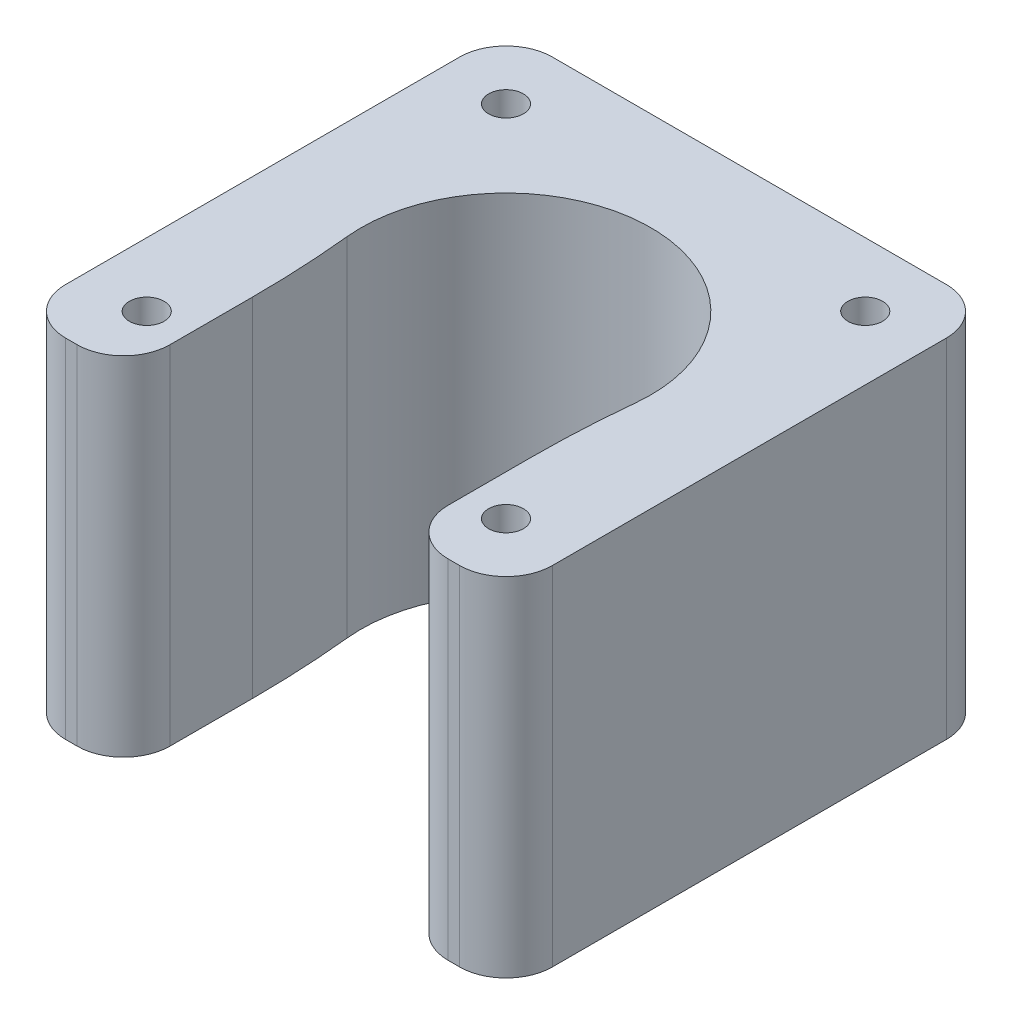
ISO-10303-21;
HEADER;
FILE_DESCRIPTION(('STEP AP214'),'2;1');
FILE_NAME('part.step','',(''),(''),'','','');
FILE_SCHEMA(('AUTOMOTIVE_DESIGN { 1 0 10303 214 1 1 1 1 }'));
ENDSEC;
DATA;
#1=APPLICATION_CONTEXT('core data for automotive mechanical design processes');
#2=APPLICATION_PROTOCOL_DEFINITION('international standard','automotive_design',2000,#1);
#3=PRODUCT_CONTEXT('',#1,'mechanical');
#4=PRODUCT('Part','Part','',(#3));
#5=PRODUCT_RELATED_PRODUCT_CATEGORY('part','',(#4));
#6=PRODUCT_DEFINITION_FORMATION('','',#4);
#7=PRODUCT_DEFINITION_CONTEXT('part definition',#1,'design');
#8=PRODUCT_DEFINITION('design','',#6,#7);
#9=PRODUCT_DEFINITION_SHAPE('','',#8);
#10=(LENGTH_UNIT() NAMED_UNIT(*) SI_UNIT(.MILLI.,.METRE.));
#11=(NAMED_UNIT(*) PLANE_ANGLE_UNIT() SI_UNIT($,.RADIAN.));
#12=(NAMED_UNIT(*) SI_UNIT($,.STERADIAN.) SOLID_ANGLE_UNIT());
#13=UNCERTAINTY_MEASURE_WITH_UNIT(LENGTH_MEASURE(1.E-05),#10,'distance_accuracy_value','');
#14=(GEOMETRIC_REPRESENTATION_CONTEXT(3) GLOBAL_UNCERTAINTY_ASSIGNED_CONTEXT((#13)) GLOBAL_UNIT_ASSIGNED_CONTEXT((#10,
#11,#12)) REPRESENTATION_CONTEXT('',''));
#15=CARTESIAN_POINT('',(0.,0.,0.));
#16=DIRECTION('',(0.,0.,1.));
#17=DIRECTION('',(1.,0.,0.));
#18=AXIS2_PLACEMENT_3D('',#15,#16,#17);
#19=CARTESIAN_POINT('',(0.,30.,0.));
#20=DIRECTION('',(0.,-1.,0.));
#21=DIRECTION('',(0.,0.,-1.));
#22=AXIS2_PLACEMENT_3D('',#19,#20,#21);
#23=CYLINDRICAL_SURFACE('',#22,12.5);
#24=CARTESIAN_POINT('',(0.,30.,0.));
#25=DIRECTION('',(0.,1.,0.));
#26=DIRECTION('',(0.,0.,1.));
#27=AXIS2_PLACEMENT_3D('',#24,#25,#26);
#28=CIRCLE('',#27,12.5);
#29=CARTESIAN_POINT('',(12.4358974358974,30.,1.26430018739205));
#30=VERTEX_POINT('',#29);
#31=CARTESIAN_POINT('',(-12.4358974358974,30.,1.26430018739205));
#32=VERTEX_POINT('',#31);
#33=EDGE_CURVE('E296',#30,#32,#28,.T.);
#34=ORIENTED_EDGE('',*,*,#33,.T.);
#35=DIRECTION('',(0.,-1.,0.));
#36=VECTOR('',#35,1.);
#37=CARTESIAN_POINT('',(-12.4358974358974,30.,1.26430018739205));
#38=LINE('',#37,#36);
#39=CARTESIAN_POINT('',(-12.4358974358974,0.,1.26430018739205));
#40=VERTEX_POINT('',#39);
#41=EDGE_CURVE('E162',#32,#40,#38,.T.);
#42=ORIENTED_EDGE('',*,*,#41,.T.);
#43=CARTESIAN_POINT('',(0.,0.,0.));
#44=DIRECTION('',(0.,1.,0.));
#45=DIRECTION('',(0.,0.,1.));
#46=AXIS2_PLACEMENT_3D('',#43,#44,#45);
#47=CIRCLE('',#46,12.5);
#48=CARTESIAN_POINT('',(12.4358974358974,0.,1.26430018739205));
#49=VERTEX_POINT('',#48);
#50=EDGE_CURVE('E154',#49,#40,#47,.T.);
#51=ORIENTED_EDGE('',*,*,#50,.F.);
#52=DIRECTION('',(0.,-1.,0.));
#53=VECTOR('',#52,1.);
#54=CARTESIAN_POINT('',(12.4358974358974,30.,1.26430018739205));
#55=LINE('',#54,#53);
#56=EDGE_CURVE('E167',#49,#30,#55,.F.);
#57=ORIENTED_EDGE('',*,*,#56,.T.);
#58=EDGE_LOOP('',(#34,#42,#51,#57));
#59=FACE_BOUND('',#58,.T.);
#60=ADVANCED_FACE('F36',(#59),#23,.F.);
#61=CARTESIAN_POINT('',(12.,30.,0.));
#62=DIRECTION('',(1.,0.,0.));
#63=DIRECTION('',(0.,0.,-1.));
#64=AXIS2_PLACEMENT_3D('',#61,#62,#63);
#65=PLANE('',#64);
#66=DIRECTION('',(0.,0.,1.));
#67=VECTOR('',#66,1.);
#68=CARTESIAN_POINT('',(12.,0.,0.));
#69=LINE('',#68,#67);
#70=CARTESIAN_POINT('',(12.,0.,9.86154146165802));
#71=VERTEX_POINT('',#70);
#72=CARTESIAN_POINT('',(12.,0.,17.));
#73=VERTEX_POINT('',#72);
#74=EDGE_CURVE('E156',#71,#73,#69,.T.);
#75=ORIENTED_EDGE('',*,*,#74,.T.);
#76=DIRECTION('',(0.,-1.,0.));
#77=VECTOR('',#76,1.);
#78=CARTESIAN_POINT('',(12.,30.,17.));
#79=LINE('',#78,#77);
#80=CARTESIAN_POINT('',(12.,30.,17.));
#81=VERTEX_POINT('',#80);
#82=EDGE_CURVE('E11',#73,#81,#79,.F.);
#83=ORIENTED_EDGE('',*,*,#82,.T.);
#84=DIRECTION('',(0.,0.,1.));
#85=VECTOR('',#84,1.);
#86=CARTESIAN_POINT('',(12.,30.,0.));
#87=LINE('',#86,#85);
#88=CARTESIAN_POINT('',(12.,30.,9.86154146165802));
#89=VERTEX_POINT('',#88);
#90=EDGE_CURVE('E259',#89,#81,#87,.T.);
#91=ORIENTED_EDGE('',*,*,#90,.F.);
#92=DIRECTION('',(0.,1.,0.));
#93=VECTOR('',#92,1.);
#94=CARTESIAN_POINT('',(12.,0.,9.86154146165802));
#95=LINE('',#94,#93);
#96=EDGE_CURVE('E191',#89,#71,#95,.F.);
#97=ORIENTED_EDGE('',*,*,#96,.T.);
#98=EDGE_LOOP('',(#75,#83,#91,#97));
#99=FACE_BOUND('',#98,.T.);
#100=ADVANCED_FACE('F318',(#99),#65,.F.);
#101=CARTESIAN_POINT('',(0.,30.,21.));
#102=DIRECTION('',(0.,0.,-1.));
#103=DIRECTION('',(-1.,0.,0.));
#104=AXIS2_PLACEMENT_3D('',#101,#102,#103);
#105=PLANE('',#104);
#106=DIRECTION('',(1.,0.,0.));
#107=VECTOR('',#106,1.);
#108=CARTESIAN_POINT('',(0.,0.,21.));
#109=LINE('',#108,#107);
#110=CARTESIAN_POINT('',(16.,0.,21.));
#111=VERTEX_POINT('',#110);
#112=CARTESIAN_POINT('',(17.,0.,21.));
#113=VERTEX_POINT('',#112);
#114=EDGE_CURVE('E249',#111,#113,#109,.T.);
#115=ORIENTED_EDGE('',*,*,#114,.T.);
#116=DIRECTION('',(0.,-1.,0.));
#117=VECTOR('',#116,1.);
#118=CARTESIAN_POINT('',(17.,30.,21.));
#119=LINE('',#118,#117);
#120=CARTESIAN_POINT('',(17.,30.,21.));
#121=VERTEX_POINT('',#120);
#122=EDGE_CURVE('E44',#113,#121,#119,.F.);
#123=ORIENTED_EDGE('',*,*,#122,.T.);
#124=DIRECTION('',(1.,0.,0.));
#125=VECTOR('',#124,1.);
#126=CARTESIAN_POINT('',(0.,30.,21.));
#127=LINE('',#126,#125);
#128=CARTESIAN_POINT('',(16.,30.,21.));
#129=VERTEX_POINT('',#128);
#130=EDGE_CURVE('E246',#129,#121,#127,.T.);
#131=ORIENTED_EDGE('',*,*,#130,.F.);
#132=DIRECTION('',(0.,-1.,0.));
#133=VECTOR('',#132,1.);
#134=CARTESIAN_POINT('',(16.,30.,21.));
#135=LINE('',#134,#133);
#136=EDGE_CURVE('E238',#129,#111,#135,.T.);
#137=ORIENTED_EDGE('',*,*,#136,.T.);
#138=EDGE_LOOP('',(#115,#123,#131,#137));
#139=FACE_BOUND('',#138,.T.);
#140=ADVANCED_FACE('F245',(#139),#105,.F.);
#141=CARTESIAN_POINT('',(21.,30.,0.));
#142=DIRECTION('',(-1.,0.,0.));
#143=DIRECTION('',(0.,0.,1.));
#144=AXIS2_PLACEMENT_3D('',#141,#142,#143);
#145=PLANE('',#144);
#146=DIRECTION('',(0.,0.,-1.));
#147=VECTOR('',#146,1.);
#148=CARTESIAN_POINT('',(21.,0.,0.));
#149=LINE('',#148,#147);
#150=CARTESIAN_POINT('',(21.,0.,17.));
#151=VERTEX_POINT('',#150);
#152=CARTESIAN_POINT('',(21.,0.,-17.));
#153=VERTEX_POINT('',#152);
#154=EDGE_CURVE('E267',#151,#153,#149,.T.);
#155=ORIENTED_EDGE('',*,*,#154,.T.);
#156=DIRECTION('',(0.,-1.,0.));
#157=VECTOR('',#156,1.);
#158=CARTESIAN_POINT('',(21.,30.,-17.));
#159=LINE('',#158,#157);
#160=CARTESIAN_POINT('',(21.,30.,-17.));
#161=VERTEX_POINT('',#160);
#162=EDGE_CURVE('E229',#153,#161,#159,.F.);
#163=ORIENTED_EDGE('',*,*,#162,.T.);
#164=DIRECTION('',(0.,0.,-1.));
#165=VECTOR('',#164,1.);
#166=CARTESIAN_POINT('',(21.,30.,0.));
#167=LINE('',#166,#165);
#168=CARTESIAN_POINT('',(21.,30.,17.));
#169=VERTEX_POINT('',#168);
#170=EDGE_CURVE('E258',#169,#161,#167,.T.);
#171=ORIENTED_EDGE('',*,*,#170,.F.);
#172=DIRECTION('',(0.,-1.,0.));
#173=VECTOR('',#172,1.);
#174=CARTESIAN_POINT('',(21.,30.,17.));
#175=LINE('',#174,#173);
#176=EDGE_CURVE('E226',#169,#151,#175,.T.);
#177=ORIENTED_EDGE('',*,*,#176,.T.);
#178=EDGE_LOOP('',(#155,#163,#171,#177));
#179=FACE_BOUND('',#178,.T.);
#180=ADVANCED_FACE('F266',(#179),#145,.F.);
#181=CARTESIAN_POINT('',(0.,30.,-21.));
#182=DIRECTION('',(0.,0.,-1.));
#183=DIRECTION('',(-1.,0.,0.));
#184=AXIS2_PLACEMENT_3D('',#181,#182,#183);
#185=PLANE('',#184);
#186=DIRECTION('',(1.,0.,0.));
#187=VECTOR('',#186,1.);
#188=CARTESIAN_POINT('',(0.,0.,-21.));
#189=LINE('',#188,#187);
#190=CARTESIAN_POINT('',(-17.,0.,-21.));
#191=VERTEX_POINT('',#190);
#192=CARTESIAN_POINT('',(17.,0.,-21.));
#193=VERTEX_POINT('',#192);
#194=EDGE_CURVE('E270',#191,#193,#189,.T.);
#195=ORIENTED_EDGE('',*,*,#194,.F.);
#196=DIRECTION('',(0.,-1.,0.));
#197=VECTOR('',#196,1.);
#198=CARTESIAN_POINT('',(-17.,30.,-21.));
#199=LINE('',#198,#197);
#200=CARTESIAN_POINT('',(-17.,30.,-21.));
#201=VERTEX_POINT('',#200);
#202=EDGE_CURVE('E213',#191,#201,#199,.F.);
#203=ORIENTED_EDGE('',*,*,#202,.T.);
#204=DIRECTION('',(1.,0.,0.));
#205=VECTOR('',#204,1.);
#206=CARTESIAN_POINT('',(0.,30.,-21.));
#207=LINE('',#206,#205);
#208=CARTESIAN_POINT('',(17.,30.,-21.));
#209=VERTEX_POINT('',#208);
#210=EDGE_CURVE('E301',#201,#209,#207,.T.);
#211=ORIENTED_EDGE('',*,*,#210,.T.);
#212=DIRECTION('',(0.,-1.,0.));
#213=VECTOR('',#212,1.);
#214=CARTESIAN_POINT('',(17.,0.,-21.));
#215=LINE('',#214,#213);
#216=EDGE_CURVE('E210',#209,#193,#215,.T.);
#217=ORIENTED_EDGE('',*,*,#216,.T.);
#218=EDGE_LOOP('',(#195,#203,#211,#217));
#219=FACE_BOUND('',#218,.T.);
#220=ADVANCED_FACE('F393',(#219),#185,.T.);
#221=CARTESIAN_POINT('',(-21.,30.,0.));
#222=DIRECTION('',(-1.,0.,0.));
#223=DIRECTION('',(0.,0.,1.));
#224=AXIS2_PLACEMENT_3D('',#221,#222,#223);
#225=PLANE('',#224);
#226=DIRECTION('',(0.,0.,-1.));
#227=VECTOR('',#226,1.);
#228=CARTESIAN_POINT('',(-21.,30.,0.));
#229=LINE('',#228,#227);
#230=CARTESIAN_POINT('',(-21.,30.,17.));
#231=VERTEX_POINT('',#230);
#232=CARTESIAN_POINT('',(-21.,30.,-17.));
#233=VERTEX_POINT('',#232);
#234=EDGE_CURVE('E299',#231,#233,#229,.T.);
#235=ORIENTED_EDGE('',*,*,#234,.T.);
#236=DIRECTION('',(0.,-1.,0.));
#237=VECTOR('',#236,1.);
#238=CARTESIAN_POINT('',(-21.,30.,-17.));
#239=LINE('',#238,#237);
#240=CARTESIAN_POINT('',(-21.,0.,-17.));
#241=VERTEX_POINT('',#240);
#242=EDGE_CURVE('E195',#233,#241,#239,.T.);
#243=ORIENTED_EDGE('',*,*,#242,.T.);
#244=DIRECTION('',(0.,0.,-1.));
#245=VECTOR('',#244,1.);
#246=CARTESIAN_POINT('',(-21.,0.,0.));
#247=LINE('',#246,#245);
#248=CARTESIAN_POINT('',(-21.,0.,17.));
#249=VERTEX_POINT('',#248);
#250=EDGE_CURVE('E272',#249,#241,#247,.T.);
#251=ORIENTED_EDGE('',*,*,#250,.F.);
#252=DIRECTION('',(0.,-1.,0.));
#253=VECTOR('',#252,1.);
#254=CARTESIAN_POINT('',(-21.,30.,17.));
#255=LINE('',#254,#253);
#256=EDGE_CURVE('E193',#249,#231,#255,.F.);
#257=ORIENTED_EDGE('',*,*,#256,.T.);
#258=EDGE_LOOP('',(#235,#243,#251,#257));
#259=FACE_BOUND('',#258,.T.);
#260=ADVANCED_FACE('F390',(#259),#225,.T.);
#261=CARTESIAN_POINT('',(-17.,30.,21.));
#262=VERTEX_POINT('',#261);
#263=CARTESIAN_POINT('',(-16.,30.,21.));
#264=VERTEX_POINT('',#263);
#265=EDGE_CURVE('E179',#262,#264,#127,.T.);
#266=ORIENTED_EDGE('',*,*,#265,.F.);
#267=DIRECTION('',(0.,-1.,0.));
#268=VECTOR('',#267,1.);
#269=CARTESIAN_POINT('',(-17.,0.,21.));
#270=LINE('',#269,#268);
#271=CARTESIAN_POINT('',(-17.,0.,21.));
#272=VERTEX_POINT('',#271);
#273=EDGE_CURVE('E232',#262,#272,#270,.T.);
#274=ORIENTED_EDGE('',*,*,#273,.T.);
#275=CARTESIAN_POINT('',(-16.,0.,21.));
#276=VERTEX_POINT('',#275);
#277=EDGE_CURVE('E275',#272,#276,#109,.T.);
#278=ORIENTED_EDGE('',*,*,#277,.T.);
#279=DIRECTION('',(0.,-1.,0.));
#280=VECTOR('',#279,1.);
#281=CARTESIAN_POINT('',(-16.,30.,21.));
#282=LINE('',#281,#280);
#283=EDGE_CURVE('E51',#276,#264,#282,.F.);
#284=ORIENTED_EDGE('',*,*,#283,.T.);
#285=EDGE_LOOP('',(#266,#274,#278,#284));
#286=FACE_BOUND('',#285,.T.);
#287=ADVANCED_FACE('F338',(#286),#105,.F.);
#288=CARTESIAN_POINT('',(15.5,30.,15.5));
#289=DIRECTION('',(0.,-1.,0.));
#290=DIRECTION('',(0.,0.,-1.));
#291=AXIS2_PLACEMENT_3D('',#288,#289,#290);
#292=CYLINDRICAL_SURFACE('',#291,1.5);
#293=CARTESIAN_POINT('',(15.5,30.,15.5));
#294=DIRECTION('',(0.,1.,0.));
#295=DIRECTION('',(0.,0.,1.));
#296=AXIS2_PLACEMENT_3D('',#293,#294,#295);
#297=CIRCLE('',#296,1.5);
#298=CARTESIAN_POINT('',(15.5,30.,17.));
#299=VERTEX_POINT('',#298);
#300=EDGE_CURVE('E293',#299,#299,#297,.T.);
#301=ORIENTED_EDGE('',*,*,#300,.T.);
#302=EDGE_LOOP('',(#301));
#303=FACE_BOUND('',#302,.T.);
#304=CARTESIAN_POINT('',(15.5,0.,15.5));
#305=DIRECTION('',(0.,1.,0.));
#306=DIRECTION('',(0.,0.,1.));
#307=AXIS2_PLACEMENT_3D('',#304,#305,#306);
#308=CIRCLE('',#307,1.5);
#309=CARTESIAN_POINT('',(15.5,0.,17.));
#310=VERTEX_POINT('',#309);
#311=EDGE_CURVE('E170',#310,#310,#308,.T.);
#312=ORIENTED_EDGE('',*,*,#311,.F.);
#313=EDGE_LOOP('',(#312));
#314=FACE_BOUND('',#313,.T.);
#315=ADVANCED_FACE('F334',(#303,#314),#292,.F.);
#316=CARTESIAN_POINT('',(-15.5,30.,15.5));
#317=DIRECTION('',(0.,-1.,0.));
#318=DIRECTION('',(0.,0.,-1.));
#319=AXIS2_PLACEMENT_3D('',#316,#317,#318);
#320=CYLINDRICAL_SURFACE('',#319,1.5);
#321=CARTESIAN_POINT('',(-15.5,30.,15.5));
#322=DIRECTION('',(0.,1.,0.));
#323=DIRECTION('',(0.,0.,1.));
#324=AXIS2_PLACEMENT_3D('',#321,#322,#323);
#325=CIRCLE('',#324,1.5);
#326=CARTESIAN_POINT('',(-15.5,30.,17.));
#327=VERTEX_POINT('',#326);
#328=EDGE_CURVE('E288',#327,#327,#325,.T.);
#329=ORIENTED_EDGE('',*,*,#328,.T.);
#330=EDGE_LOOP('',(#329));
#331=FACE_BOUND('',#330,.T.);
#332=CARTESIAN_POINT('',(-15.5,0.,15.5));
#333=DIRECTION('',(0.,1.,0.));
#334=DIRECTION('',(0.,0.,1.));
#335=AXIS2_PLACEMENT_3D('',#332,#333,#334);
#336=CIRCLE('',#335,1.5);
#337=CARTESIAN_POINT('',(-15.5,0.,17.));
#338=VERTEX_POINT('',#337);
#339=EDGE_CURVE('E312',#338,#338,#336,.T.);
#340=ORIENTED_EDGE('',*,*,#339,.F.);
#341=EDGE_LOOP('',(#340));
#342=FACE_BOUND('',#341,.T.);
#343=ADVANCED_FACE('F337',(#331,#342),#320,.F.);
#344=CARTESIAN_POINT('',(15.5,30.,-15.5));
#345=DIRECTION('',(0.,-1.,0.));
#346=DIRECTION('',(0.,0.,-1.));
#347=AXIS2_PLACEMENT_3D('',#344,#345,#346);
#348=CYLINDRICAL_SURFACE('',#347,1.5);
#349=CARTESIAN_POINT('',(15.5,30.,-15.5));
#350=DIRECTION('',(0.,1.,0.));
#351=DIRECTION('',(0.,0.,1.));
#352=AXIS2_PLACEMENT_3D('',#349,#350,#351);
#353=CIRCLE('',#352,1.5);
#354=CARTESIAN_POINT('',(15.5,30.,-14.));
#355=VERTEX_POINT('',#354);
#356=EDGE_CURVE('E283',#355,#355,#353,.T.);
#357=ORIENTED_EDGE('',*,*,#356,.T.);
#358=EDGE_LOOP('',(#357));
#359=FACE_BOUND('',#358,.T.);
#360=CARTESIAN_POINT('',(15.5,0.,-15.5));
#361=DIRECTION('',(0.,1.,0.));
#362=DIRECTION('',(0.,0.,1.));
#363=AXIS2_PLACEMENT_3D('',#360,#361,#362);
#364=CIRCLE('',#363,1.5);
#365=CARTESIAN_POINT('',(15.5,0.,-14.));
#366=VERTEX_POINT('',#365);
#367=EDGE_CURVE('E309',#366,#366,#364,.T.);
#368=ORIENTED_EDGE('',*,*,#367,.F.);
#369=EDGE_LOOP('',(#368));
#370=FACE_BOUND('',#369,.T.);
#371=ADVANCED_FACE('F342',(#359,#370),#348,.F.);
#372=CARTESIAN_POINT('',(-15.5,30.,-15.5));
#373=DIRECTION('',(0.,-1.,0.));
#374=DIRECTION('',(0.,0.,-1.));
#375=AXIS2_PLACEMENT_3D('',#372,#373,#374);
#376=CYLINDRICAL_SURFACE('',#375,1.5);
#377=CARTESIAN_POINT('',(-15.5,30.,-15.5));
#378=DIRECTION('',(0.,1.,0.));
#379=DIRECTION('',(0.,0.,1.));
#380=AXIS2_PLACEMENT_3D('',#377,#378,#379);
#381=CIRCLE('',#380,1.5);
#382=CARTESIAN_POINT('',(-15.5,30.,-14.));
#383=VERTEX_POINT('',#382);
#384=EDGE_CURVE('E280',#383,#383,#381,.T.);
#385=ORIENTED_EDGE('',*,*,#384,.T.);
#386=EDGE_LOOP('',(#385));
#387=FACE_BOUND('',#386,.T.);
#388=CARTESIAN_POINT('',(-15.5,0.,-15.5));
#389=DIRECTION('',(0.,1.,0.));
#390=DIRECTION('',(0.,0.,1.));
#391=AXIS2_PLACEMENT_3D('',#388,#389,#390);
#392=CIRCLE('',#391,1.5);
#393=CARTESIAN_POINT('',(-15.5,0.,-14.));
#394=VERTEX_POINT('',#393);
#395=EDGE_CURVE('E306',#394,#394,#392,.T.);
#396=ORIENTED_EDGE('',*,*,#395,.F.);
#397=EDGE_LOOP('',(#396));
#398=FACE_BOUND('',#397,.T.);
#399=ADVANCED_FACE('F346',(#387,#398),#376,.F.);
#400=CARTESIAN_POINT('',(-12.,30.,0.));
#401=DIRECTION('',(1.,0.,0.));
#402=DIRECTION('',(0.,0.,-1.));
#403=AXIS2_PLACEMENT_3D('',#400,#401,#402);
#404=PLANE('',#403);
#405=DIRECTION('',(0.,0.,1.));
#406=VECTOR('',#405,1.);
#407=CARTESIAN_POINT('',(-12.,30.,0.));
#408=LINE('',#407,#406);
#409=CARTESIAN_POINT('',(-12.,30.,9.86154146165802));
#410=VERTEX_POINT('',#409);
#411=CARTESIAN_POINT('',(-12.,30.,17.));
#412=VERTEX_POINT('',#411);
#413=EDGE_CURVE('E175',#410,#412,#408,.T.);
#414=ORIENTED_EDGE('',*,*,#413,.T.);
#415=DIRECTION('',(0.,-1.,0.));
#416=VECTOR('',#415,1.);
#417=CARTESIAN_POINT('',(-12.,0.,17.));
#418=LINE('',#417,#416);
#419=CARTESIAN_POINT('',(-12.,0.,17.));
#420=VERTEX_POINT('',#419);
#421=EDGE_CURVE('E235',#412,#420,#418,.T.);
#422=ORIENTED_EDGE('',*,*,#421,.T.);
#423=DIRECTION('',(0.,0.,1.));
#424=VECTOR('',#423,1.);
#425=CARTESIAN_POINT('',(-12.,0.,0.));
#426=LINE('',#425,#424);
#427=CARTESIAN_POINT('',(-12.,0.,9.86154146165802));
#428=VERTEX_POINT('',#427);
#429=EDGE_CURVE('E182',#428,#420,#426,.T.);
#430=ORIENTED_EDGE('',*,*,#429,.F.);
#431=DIRECTION('',(0.,-1.,0.));
#432=VECTOR('',#431,1.);
#433=CARTESIAN_POINT('',(-12.,30.,9.86154146165802));
#434=LINE('',#433,#432);
#435=EDGE_CURVE('E186',#428,#410,#434,.F.);
#436=ORIENTED_EDGE('',*,*,#435,.T.);
#437=EDGE_LOOP('',(#414,#422,#430,#436));
#438=FACE_BOUND('',#437,.T.);
#439=ADVANCED_FACE('F350',(#438),#404,.T.);
#440=CARTESIAN_POINT('',(0.,30.,0.));
#441=DIRECTION('',(0.,1.,0.));
#442=DIRECTION('',(0.,0.,1.));
#443=AXIS2_PLACEMENT_3D('',#440,#441,#442);
#444=PLANE('',#443);
#445=ORIENTED_EDGE('',*,*,#384,.F.);
#446=EDGE_LOOP('',(#445));
#447=FACE_BOUND('',#446,.T.);
#448=ORIENTED_EDGE('',*,*,#356,.F.);
#449=EDGE_LOOP('',(#448));
#450=FACE_BOUND('',#449,.T.);
#451=ORIENTED_EDGE('',*,*,#328,.F.);
#452=EDGE_LOOP('',(#451));
#453=FACE_BOUND('',#452,.T.);
#454=ORIENTED_EDGE('',*,*,#300,.F.);
#455=EDGE_LOOP('',(#454));
#456=FACE_BOUND('',#455,.T.);
#457=ORIENTED_EDGE('',*,*,#210,.F.);
#458=CARTESIAN_POINT('',(-17.,30.,-17.));
#459=DIRECTION('',(0.,1.,0.));
#460=DIRECTION('',(0.,0.,1.));
#461=AXIS2_PLACEMENT_3D('',#458,#459,#460);
#462=CIRCLE('',#461,4.);
#463=EDGE_CURVE('E224',#201,#233,#462,.T.);
#464=ORIENTED_EDGE('',*,*,#463,.T.);
#465=ORIENTED_EDGE('',*,*,#234,.F.);
#466=CARTESIAN_POINT('',(-17.,30.,17.));
#467=DIRECTION('',(0.,1.,0.));
#468=DIRECTION('',(0.,0.,1.));
#469=AXIS2_PLACEMENT_3D('',#466,#467,#468);
#470=CIRCLE('',#469,4.);
#471=EDGE_CURVE('E58',#231,#262,#470,.T.);
#472=ORIENTED_EDGE('',*,*,#471,.T.);
#473=ORIENTED_EDGE('',*,*,#265,.T.);
#474=CARTESIAN_POINT('',(-16.,30.,17.));
#475=DIRECTION('',(0.,1.,0.));
#476=DIRECTION('',(0.,0.,1.));
#477=AXIS2_PLACEMENT_3D('',#474,#475,#476);
#478=CIRCLE('',#477,4.);
#479=EDGE_CURVE('E219',#264,#412,#478,.T.);
#480=ORIENTED_EDGE('',*,*,#479,.T.);
#481=ORIENTED_EDGE('',*,*,#413,.F.);
#482=CARTESIAN_POINT('',(-97.,30.,9.86154146165802));
#483=DIRECTION('',(0.,1.,0.));
#484=DIRECTION('',(0.,0.,1.));
#485=AXIS2_PLACEMENT_3D('',#482,#483,#484);
#486=CIRCLE('',#485,85.);
#487=EDGE_CURVE('E189',#410,#32,#486,.T.);
#488=ORIENTED_EDGE('',*,*,#487,.T.);
#489=ORIENTED_EDGE('',*,*,#33,.F.);
#490=CARTESIAN_POINT('',(97.,30.,9.86154146165802));
#491=DIRECTION('',(0.,1.,0.));
#492=DIRECTION('',(0.,0.,1.));
#493=AXIS2_PLACEMENT_3D('',#490,#491,#492);
#494=CIRCLE('',#493,85.);
#495=EDGE_CURVE('E174',#30,#89,#494,.T.);
#496=ORIENTED_EDGE('',*,*,#495,.T.);
#497=ORIENTED_EDGE('',*,*,#90,.T.);
#498=CARTESIAN_POINT('',(16.,30.,17.));
#499=DIRECTION('',(0.,1.,0.));
#500=DIRECTION('',(0.,0.,1.));
#501=AXIS2_PLACEMENT_3D('',#498,#499,#500);
#502=CIRCLE('',#501,4.);
#503=EDGE_CURVE('E215',#81,#129,#502,.T.);
#504=ORIENTED_EDGE('',*,*,#503,.T.);
#505=ORIENTED_EDGE('',*,*,#130,.T.);
#506=CARTESIAN_POINT('',(17.,30.,17.));
#507=DIRECTION('',(0.,1.,0.));
#508=DIRECTION('',(0.,0.,1.));
#509=AXIS2_PLACEMENT_3D('',#506,#507,#508);
#510=CIRCLE('',#509,4.);
#511=EDGE_CURVE('E217',#121,#169,#510,.T.);
#512=ORIENTED_EDGE('',*,*,#511,.T.);
#513=ORIENTED_EDGE('',*,*,#170,.T.);
#514=CARTESIAN_POINT('',(17.,30.,-17.));
#515=DIRECTION('',(0.,1.,0.));
#516=DIRECTION('',(0.,0.,1.));
#517=AXIS2_PLACEMENT_3D('',#514,#515,#516);
#518=CIRCLE('',#517,4.);
#519=EDGE_CURVE('E222',#161,#209,#518,.T.);
#520=ORIENTED_EDGE('',*,*,#519,.T.);
#521=EDGE_LOOP('',(#457,#464,#465,#472,#473,#480,#481,#488,#489,#496,#497,#504,#505,#512,#513,#520));
#522=FACE_BOUND('',#521,.T.);
#523=ADVANCED_FACE('F253',(#447,#450,#453,#456,#522),#444,.T.);
#524=CARTESIAN_POINT('',(0.,0.,0.));
#525=DIRECTION('',(0.,1.,0.));
#526=DIRECTION('',(0.,0.,1.));
#527=AXIS2_PLACEMENT_3D('',#524,#525,#526);
#528=PLANE('',#527);
#529=ORIENTED_EDGE('',*,*,#395,.T.);
#530=EDGE_LOOP('',(#529));
#531=FACE_BOUND('',#530,.T.);
#532=ORIENTED_EDGE('',*,*,#367,.T.);
#533=EDGE_LOOP('',(#532));
#534=FACE_BOUND('',#533,.T.);
#535=ORIENTED_EDGE('',*,*,#339,.T.);
#536=EDGE_LOOP('',(#535));
#537=FACE_BOUND('',#536,.T.);
#538=ORIENTED_EDGE('',*,*,#311,.T.);
#539=EDGE_LOOP('',(#538));
#540=FACE_BOUND('',#539,.T.);
#541=ORIENTED_EDGE('',*,*,#250,.T.);
#542=CARTESIAN_POINT('',(-17.,0.,-17.));
#543=DIRECTION('',(0.,1.,0.));
#544=DIRECTION('',(0.,0.,1.));
#545=AXIS2_PLACEMENT_3D('',#542,#543,#544);
#546=CIRCLE('',#545,4.);
#547=EDGE_CURVE('E208',#241,#191,#546,.F.);
#548=ORIENTED_EDGE('',*,*,#547,.T.);
#549=ORIENTED_EDGE('',*,*,#194,.T.);
#550=CARTESIAN_POINT('',(17.,0.,-17.));
#551=DIRECTION('',(0.,1.,0.));
#552=DIRECTION('',(0.,0.,1.));
#553=AXIS2_PLACEMENT_3D('',#550,#551,#552);
#554=CIRCLE('',#553,4.);
#555=EDGE_CURVE('E206',#193,#153,#554,.F.);
#556=ORIENTED_EDGE('',*,*,#555,.T.);
#557=ORIENTED_EDGE('',*,*,#154,.F.);
#558=CARTESIAN_POINT('',(17.,0.,17.));
#559=DIRECTION('',(0.,1.,0.));
#560=DIRECTION('',(0.,0.,1.));
#561=AXIS2_PLACEMENT_3D('',#558,#559,#560);
#562=CIRCLE('',#561,4.);
#563=EDGE_CURVE('E200',#151,#113,#562,.F.);
#564=ORIENTED_EDGE('',*,*,#563,.T.);
#565=ORIENTED_EDGE('',*,*,#114,.F.);
#566=CARTESIAN_POINT('',(16.,0.,17.));
#567=DIRECTION('',(0.,1.,0.));
#568=DIRECTION('',(0.,0.,1.));
#569=AXIS2_PLACEMENT_3D('',#566,#567,#568);
#570=CIRCLE('',#569,4.);
#571=EDGE_CURVE('E198',#111,#73,#570,.F.);
#572=ORIENTED_EDGE('',*,*,#571,.T.);
#573=ORIENTED_EDGE('',*,*,#74,.F.);
#574=CARTESIAN_POINT('',(97.,0.,9.86154146165802));
#575=DIRECTION('',(0.,1.,0.));
#576=DIRECTION('',(0.,0.,1.));
#577=AXIS2_PLACEMENT_3D('',#574,#575,#576);
#578=CIRCLE('',#577,85.);
#579=EDGE_CURVE('E150',#71,#49,#578,.F.);
#580=ORIENTED_EDGE('',*,*,#579,.T.);
#581=ORIENTED_EDGE('',*,*,#50,.T.);
#582=CARTESIAN_POINT('',(-97.,0.,9.86154146165802));
#583=DIRECTION('',(0.,1.,0.));
#584=DIRECTION('',(0.,0.,1.));
#585=AXIS2_PLACEMENT_3D('',#582,#583,#584);
#586=CIRCLE('',#585,85.);
#587=EDGE_CURVE('E161',#40,#428,#586,.F.);
#588=ORIENTED_EDGE('',*,*,#587,.T.);
#589=ORIENTED_EDGE('',*,*,#429,.T.);
#590=CARTESIAN_POINT('',(-16.,0.,17.));
#591=DIRECTION('',(0.,1.,0.));
#592=DIRECTION('',(0.,0.,1.));
#593=AXIS2_PLACEMENT_3D('',#590,#591,#592);
#594=CIRCLE('',#593,4.);
#595=EDGE_CURVE('E202',#420,#276,#594,.F.);
#596=ORIENTED_EDGE('',*,*,#595,.T.);
#597=ORIENTED_EDGE('',*,*,#277,.F.);
#598=CARTESIAN_POINT('',(-17.,0.,17.));
#599=DIRECTION('',(0.,1.,0.));
#600=DIRECTION('',(0.,0.,1.));
#601=AXIS2_PLACEMENT_3D('',#598,#599,#600);
#602=CIRCLE('',#601,4.);
#603=EDGE_CURVE('E204',#272,#249,#602,.F.);
#604=ORIENTED_EDGE('',*,*,#603,.T.);
#605=EDGE_LOOP('',(#541,#548,#549,#556,#557,#564,#565,#572,#573,#580,#581,#588,#589,#596,#597,#604));
#606=FACE_BOUND('',#605,.T.);
#607=ADVANCED_FACE('F153',(#531,#534,#537,#540,#606),#528,.F.);
#608=CARTESIAN_POINT('',(-97.,30.,9.86154146165802));
#609=DIRECTION('',(0.,-1.,0.));
#610=DIRECTION('',(0.,0.,-1.));
#611=AXIS2_PLACEMENT_3D('',#608,#609,#610);
#612=CYLINDRICAL_SURFACE('',#611,85.);
#613=ORIENTED_EDGE('',*,*,#487,.F.);
#614=ORIENTED_EDGE('',*,*,#435,.F.);
#615=ORIENTED_EDGE('',*,*,#587,.F.);
#616=ORIENTED_EDGE('',*,*,#41,.F.);
#617=EDGE_LOOP('',(#613,#614,#615,#616));
#618=FACE_BOUND('',#617,.T.);
#619=ADVANCED_FACE('F351',(#618),#612,.T.);
#620=CARTESIAN_POINT('',(97.,30.,9.86154146165802));
#621=DIRECTION('',(0.,-1.,0.));
#622=DIRECTION('',(0.,0.,-1.));
#623=AXIS2_PLACEMENT_3D('',#620,#621,#622);
#624=CYLINDRICAL_SURFACE('',#623,85.);
#625=ORIENTED_EDGE('',*,*,#495,.F.);
#626=ORIENTED_EDGE('',*,*,#56,.F.);
#627=ORIENTED_EDGE('',*,*,#579,.F.);
#628=ORIENTED_EDGE('',*,*,#96,.F.);
#629=EDGE_LOOP('',(#625,#626,#627,#628));
#630=FACE_BOUND('',#629,.T.);
#631=ADVANCED_FACE('F173',(#630),#624,.T.);
#632=CARTESIAN_POINT('',(-17.,30.,-17.));
#633=DIRECTION('',(0.,-1.,0.));
#634=DIRECTION('',(0.,0.,-1.));
#635=AXIS2_PLACEMENT_3D('',#632,#633,#634);
#636=CYLINDRICAL_SURFACE('',#635,4.);
#637=ORIENTED_EDGE('',*,*,#463,.F.);
#638=ORIENTED_EDGE('',*,*,#202,.F.);
#639=ORIENTED_EDGE('',*,*,#547,.F.);
#640=ORIENTED_EDGE('',*,*,#242,.F.);
#641=EDGE_LOOP('',(#637,#638,#639,#640));
#642=FACE_BOUND('',#641,.T.);
#643=ADVANCED_FACE('F357',(#642),#636,.T.);
#644=CARTESIAN_POINT('',(17.,30.,-17.));
#645=DIRECTION('',(0.,1.,0.));
#646=DIRECTION('',(0.,0.,1.));
#647=AXIS2_PLACEMENT_3D('',#644,#645,#646);
#648=CYLINDRICAL_SURFACE('',#647,4.);
#649=ORIENTED_EDGE('',*,*,#519,.F.);
#650=ORIENTED_EDGE('',*,*,#162,.F.);
#651=ORIENTED_EDGE('',*,*,#555,.F.);
#652=ORIENTED_EDGE('',*,*,#216,.F.);
#653=EDGE_LOOP('',(#649,#650,#651,#652));
#654=FACE_BOUND('',#653,.T.);
#655=ADVANCED_FACE('F360',(#654),#648,.T.);
#656=CARTESIAN_POINT('',(-17.,30.,17.));
#657=DIRECTION('',(0.,1.,0.));
#658=DIRECTION('',(0.,0.,1.));
#659=AXIS2_PLACEMENT_3D('',#656,#657,#658);
#660=CYLINDRICAL_SURFACE('',#659,4.);
#661=ORIENTED_EDGE('',*,*,#471,.F.);
#662=ORIENTED_EDGE('',*,*,#256,.F.);
#663=ORIENTED_EDGE('',*,*,#603,.F.);
#664=ORIENTED_EDGE('',*,*,#273,.F.);
#665=EDGE_LOOP('',(#661,#662,#663,#664));
#666=FACE_BOUND('',#665,.T.);
#667=ADVANCED_FACE('F364',(#666),#660,.T.);
#668=CARTESIAN_POINT('',(-16.,30.,17.));
#669=DIRECTION('',(0.,1.,0.));
#670=DIRECTION('',(0.,0.,1.));
#671=AXIS2_PLACEMENT_3D('',#668,#669,#670);
#672=CYLINDRICAL_SURFACE('',#671,4.);
#673=ORIENTED_EDGE('',*,*,#479,.F.);
#674=ORIENTED_EDGE('',*,*,#283,.F.);
#675=ORIENTED_EDGE('',*,*,#595,.F.);
#676=ORIENTED_EDGE('',*,*,#421,.F.);
#677=EDGE_LOOP('',(#673,#674,#675,#676));
#678=FACE_BOUND('',#677,.T.);
#679=ADVANCED_FACE('F325',(#678),#672,.T.);
#680=CARTESIAN_POINT('',(17.,30.,17.));
#681=DIRECTION('',(0.,-1.,0.));
#682=DIRECTION('',(0.,0.,-1.));
#683=AXIS2_PLACEMENT_3D('',#680,#681,#682);
#684=CYLINDRICAL_SURFACE('',#683,4.);
#685=ORIENTED_EDGE('',*,*,#511,.F.);
#686=ORIENTED_EDGE('',*,*,#122,.F.);
#687=ORIENTED_EDGE('',*,*,#563,.F.);
#688=ORIENTED_EDGE('',*,*,#176,.F.);
#689=EDGE_LOOP('',(#685,#686,#687,#688));
#690=FACE_BOUND('',#689,.T.);
#691=ADVANCED_FACE('F262',(#690),#684,.T.);
#692=CARTESIAN_POINT('',(16.,30.,17.));
#693=DIRECTION('',(0.,-1.,0.));
#694=DIRECTION('',(0.,0.,-1.));
#695=AXIS2_PLACEMENT_3D('',#692,#693,#694);
#696=CYLINDRICAL_SURFACE('',#695,4.);
#697=ORIENTED_EDGE('',*,*,#503,.F.);
#698=ORIENTED_EDGE('',*,*,#82,.F.);
#699=ORIENTED_EDGE('',*,*,#571,.F.);
#700=ORIENTED_EDGE('',*,*,#136,.F.);
#701=EDGE_LOOP('',(#697,#698,#699,#700));
#702=FACE_BOUND('',#701,.T.);
#703=ADVANCED_FACE('F38',(#702),#696,.T.);
#704=CLOSED_SHELL('',(#60,#100,#140,#180,#220,#260,#287,#315,#343,#371,#399,#439,#523,#607,#619,
#631,#643,#655,#667,#679,#691,#703));
#705=MANIFOLD_SOLID_BREP('B2',#704);
#706=ADVANCED_BREP_SHAPE_REPRESENTATION('',(#18,#705),#14);
#707=SHAPE_DEFINITION_REPRESENTATION(#9,#706);
ENDSEC;
END-ISO-10303-21;
